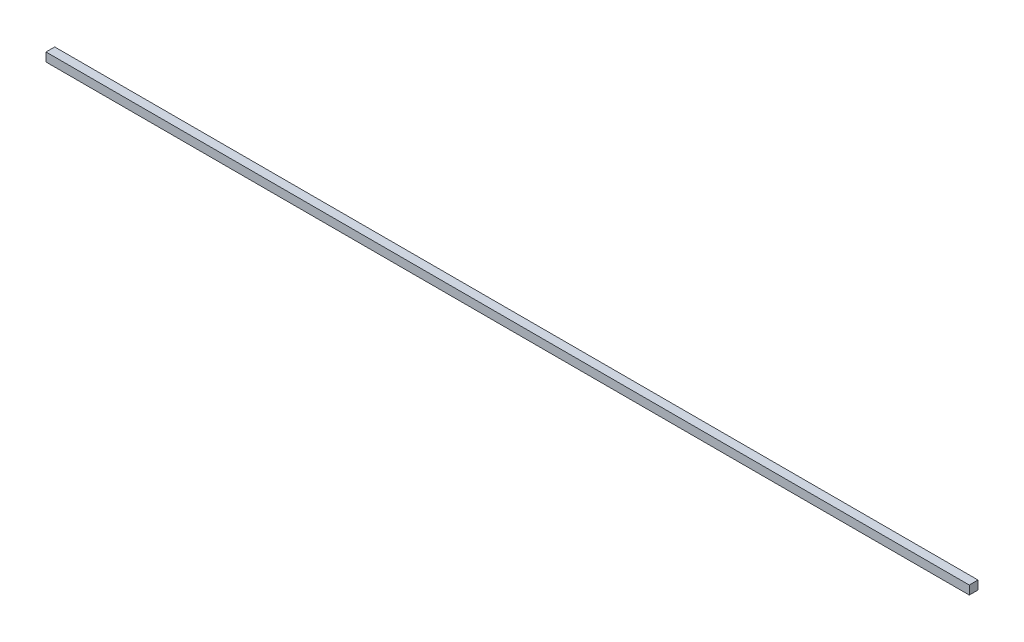
ISO-10303-21;
HEADER;
FILE_DESCRIPTION(('STEP AP214'),'2;1');
FILE_NAME('part.step','',(''),(''),'','','');
FILE_SCHEMA(('AUTOMOTIVE_DESIGN { 1 0 10303 214 1 1 1 1 }'));
ENDSEC;
DATA;
#1=APPLICATION_CONTEXT('core data for automotive mechanical design processes');
#2=APPLICATION_PROTOCOL_DEFINITION('international standard','automotive_design',2000,#1);
#3=PRODUCT_CONTEXT('',#1,'mechanical');
#4=PRODUCT('Part','Part','',(#3));
#5=PRODUCT_RELATED_PRODUCT_CATEGORY('part','',(#4));
#6=PRODUCT_DEFINITION_FORMATION('','',#4);
#7=PRODUCT_DEFINITION_CONTEXT('part definition',#1,'design');
#8=PRODUCT_DEFINITION('design','',#6,#7);
#9=PRODUCT_DEFINITION_SHAPE('','',#8);
#10=(LENGTH_UNIT() NAMED_UNIT(*) SI_UNIT(.MILLI.,.METRE.));
#11=(NAMED_UNIT(*) PLANE_ANGLE_UNIT() SI_UNIT($,.RADIAN.));
#12=(NAMED_UNIT(*) SI_UNIT($,.STERADIAN.) SOLID_ANGLE_UNIT());
#13=UNCERTAINTY_MEASURE_WITH_UNIT(LENGTH_MEASURE(1.E-05),#10,'distance_accuracy_value','');
#14=(GEOMETRIC_REPRESENTATION_CONTEXT(3) GLOBAL_UNCERTAINTY_ASSIGNED_CONTEXT((#13)) GLOBAL_UNIT_ASSIGNED_CONTEXT((#10,
#11,#12)) REPRESENTATION_CONTEXT('',''));
#15=CARTESIAN_POINT('',(0.,0.,0.));
#16=DIRECTION('',(0.,0.,1.));
#17=DIRECTION('',(1.,0.,0.));
#18=AXIS2_PLACEMENT_3D('',#15,#16,#17);
#19=CARTESIAN_POINT('',(336.55,6.35,3.175));
#20=DIRECTION('',(-1.,0.,0.));
#21=DIRECTION('',(0.,0.,1.));
#22=AXIS2_PLACEMENT_3D('',#19,#20,#21);
#23=PLANE('',#22);
#24=DIRECTION('',(0.,0.,-1.));
#25=VECTOR('',#24,1.);
#26=CARTESIAN_POINT('',(336.55,0.,3.175));
#27=LINE('',#26,#25);
#28=CARTESIAN_POINT('',(336.55,0.,3.175));
#29=VERTEX_POINT('',#28);
#30=CARTESIAN_POINT('',(336.55,0.,-3.175));
#31=VERTEX_POINT('',#30);
#32=EDGE_CURVE('E107',#29,#31,#27,.T.);
#33=ORIENTED_EDGE('',*,*,#32,.T.);
#34=DIRECTION('',(0.,-1.,0.));
#35=VECTOR('',#34,1.);
#36=CARTESIAN_POINT('',(336.55,6.35,-3.175));
#37=LINE('',#36,#35);
#38=CARTESIAN_POINT('',(336.55,6.35,-3.175));
#39=VERTEX_POINT('',#38);
#40=EDGE_CURVE('E11',#39,#31,#37,.T.);
#41=ORIENTED_EDGE('',*,*,#40,.F.);
#42=DIRECTION('',(0.,0.,-1.));
#43=VECTOR('',#42,1.);
#44=CARTESIAN_POINT('',(336.55,6.35,3.175));
#45=LINE('',#44,#43);
#46=CARTESIAN_POINT('',(336.55,6.35,3.175));
#47=VERTEX_POINT('',#46);
#48=EDGE_CURVE('E91',#47,#39,#45,.T.);
#49=ORIENTED_EDGE('',*,*,#48,.F.);
#50=DIRECTION('',(0.,-1.,0.));
#51=VECTOR('',#50,1.);
#52=CARTESIAN_POINT('',(336.55,6.35,3.175));
#53=LINE('',#52,#51);
#54=EDGE_CURVE('E103',#47,#29,#53,.T.);
#55=ORIENTED_EDGE('',*,*,#54,.T.);
#56=EDGE_LOOP('',(#33,#41,#49,#55));
#57=FACE_BOUND('',#56,.T.);
#58=ADVANCED_FACE('F39',(#57),#23,.F.);
#59=CARTESIAN_POINT('',(-336.55,6.35,-3.175));
#60=DIRECTION('',(0.,0.,1.));
#61=DIRECTION('',(1.,0.,0.));
#62=AXIS2_PLACEMENT_3D('',#59,#60,#61);
#63=PLANE('',#62);
#64=DIRECTION('',(-1.,0.,0.));
#65=VECTOR('',#64,1.);
#66=CARTESIAN_POINT('',(-336.55,0.,-3.175));
#67=LINE('',#66,#65);
#68=CARTESIAN_POINT('',(-336.55,0.,-3.175));
#69=VERTEX_POINT('',#68);
#70=EDGE_CURVE('E96',#31,#69,#67,.T.);
#71=ORIENTED_EDGE('',*,*,#70,.T.);
#72=DIRECTION('',(0.,-1.,0.));
#73=VECTOR('',#72,1.);
#74=CARTESIAN_POINT('',(-336.55,6.35,-3.175));
#75=LINE('',#74,#73);
#76=CARTESIAN_POINT('',(-336.55,6.35,-3.175));
#77=VERTEX_POINT('',#76);
#78=EDGE_CURVE('E48',#77,#69,#75,.T.);
#79=ORIENTED_EDGE('',*,*,#78,.F.);
#80=DIRECTION('',(-1.,0.,0.));
#81=VECTOR('',#80,1.);
#82=CARTESIAN_POINT('',(-336.55,6.35,-3.175));
#83=LINE('',#82,#81);
#84=EDGE_CURVE('E86',#39,#77,#83,.T.);
#85=ORIENTED_EDGE('',*,*,#84,.F.);
#86=ORIENTED_EDGE('',*,*,#40,.T.);
#87=EDGE_LOOP('',(#71,#79,#85,#86));
#88=FACE_BOUND('',#87,.T.);
#89=ADVANCED_FACE('F95',(#88),#63,.F.);
#90=CARTESIAN_POINT('',(-336.55,6.35,3.175));
#91=DIRECTION('',(1.,0.,0.));
#92=DIRECTION('',(0.,0.,-1.));
#93=AXIS2_PLACEMENT_3D('',#90,#91,#92);
#94=PLANE('',#93);
#95=DIRECTION('',(0.,0.,1.));
#96=VECTOR('',#95,1.);
#97=CARTESIAN_POINT('',(-336.55,0.,3.175));
#98=LINE('',#97,#96);
#99=CARTESIAN_POINT('',(-336.55,0.,3.175));
#100=VERTEX_POINT('',#99);
#101=EDGE_CURVE('E73',#69,#100,#98,.T.);
#102=ORIENTED_EDGE('',*,*,#101,.T.);
#103=DIRECTION('',(0.,-1.,0.));
#104=VECTOR('',#103,1.);
#105=CARTESIAN_POINT('',(-336.55,6.35,3.175));
#106=LINE('',#105,#104);
#107=CARTESIAN_POINT('',(-336.55,6.35,3.175));
#108=VERTEX_POINT('',#107);
#109=EDGE_CURVE('E98',#108,#100,#106,.T.);
#110=ORIENTED_EDGE('',*,*,#109,.F.);
#111=DIRECTION('',(0.,0.,1.));
#112=VECTOR('',#111,1.);
#113=CARTESIAN_POINT('',(-336.55,6.35,3.175));
#114=LINE('',#113,#112);
#115=EDGE_CURVE('E89',#77,#108,#114,.T.);
#116=ORIENTED_EDGE('',*,*,#115,.F.);
#117=ORIENTED_EDGE('',*,*,#78,.T.);
#118=EDGE_LOOP('',(#102,#110,#116,#117));
#119=FACE_BOUND('',#118,.T.);
#120=ADVANCED_FACE('F99',(#119),#94,.F.);
#121=CARTESIAN_POINT('',(-336.55,6.35,3.175));
#122=DIRECTION('',(0.,0.,-1.));
#123=DIRECTION('',(-1.,0.,0.));
#124=AXIS2_PLACEMENT_3D('',#121,#122,#123);
#125=PLANE('',#124);
#126=DIRECTION('',(1.,0.,0.));
#127=VECTOR('',#126,1.);
#128=CARTESIAN_POINT('',(-336.55,0.,3.175));
#129=LINE('',#128,#127);
#130=EDGE_CURVE('E79',#100,#29,#129,.T.);
#131=ORIENTED_EDGE('',*,*,#130,.T.);
#132=ORIENTED_EDGE('',*,*,#54,.F.);
#133=DIRECTION('',(1.,0.,0.));
#134=VECTOR('',#133,1.);
#135=CARTESIAN_POINT('',(-336.55,6.35,3.175));
#136=LINE('',#135,#134);
#137=EDGE_CURVE('E56',#108,#47,#136,.T.);
#138=ORIENTED_EDGE('',*,*,#137,.F.);
#139=ORIENTED_EDGE('',*,*,#109,.T.);
#140=EDGE_LOOP('',(#131,#132,#138,#139));
#141=FACE_BOUND('',#140,.T.);
#142=ADVANCED_FACE('F120',(#141),#125,.F.);
#143=CARTESIAN_POINT('',(0.,6.35,0.));
#144=DIRECTION('',(0.,-1.,0.));
#145=DIRECTION('',(0.,0.,-1.));
#146=AXIS2_PLACEMENT_3D('',#143,#144,#145);
#147=PLANE('',#146);
#148=ORIENTED_EDGE('',*,*,#48,.T.);
#149=ORIENTED_EDGE('',*,*,#84,.T.);
#150=ORIENTED_EDGE('',*,*,#115,.T.);
#151=ORIENTED_EDGE('',*,*,#137,.T.);
#152=EDGE_LOOP('',(#148,#149,#150,#151));
#153=FACE_BOUND('',#152,.T.);
#154=ADVANCED_FACE('F87',(#153),#147,.F.);
#155=CARTESIAN_POINT('',(0.,0.,0.));
#156=DIRECTION('',(0.,-1.,0.));
#157=DIRECTION('',(0.,0.,-1.));
#158=AXIS2_PLACEMENT_3D('',#155,#156,#157);
#159=PLANE('',#158);
#160=ORIENTED_EDGE('',*,*,#32,.F.);
#161=ORIENTED_EDGE('',*,*,#130,.F.);
#162=ORIENTED_EDGE('',*,*,#101,.F.);
#163=ORIENTED_EDGE('',*,*,#70,.F.);
#164=EDGE_LOOP('',(#160,#161,#162,#163));
#165=FACE_BOUND('',#164,.T.);
#166=ADVANCED_FACE('F123',(#165),#159,.T.);
#167=CLOSED_SHELL('',(#58,#89,#120,#142,#154,#166));
#168=MANIFOLD_SOLID_BREP('B2',#167);
#169=ADVANCED_BREP_SHAPE_REPRESENTATION('',(#18,#168),#14);
#170=SHAPE_DEFINITION_REPRESENTATION(#9,#169);
ENDSEC;
END-ISO-10303-21;
